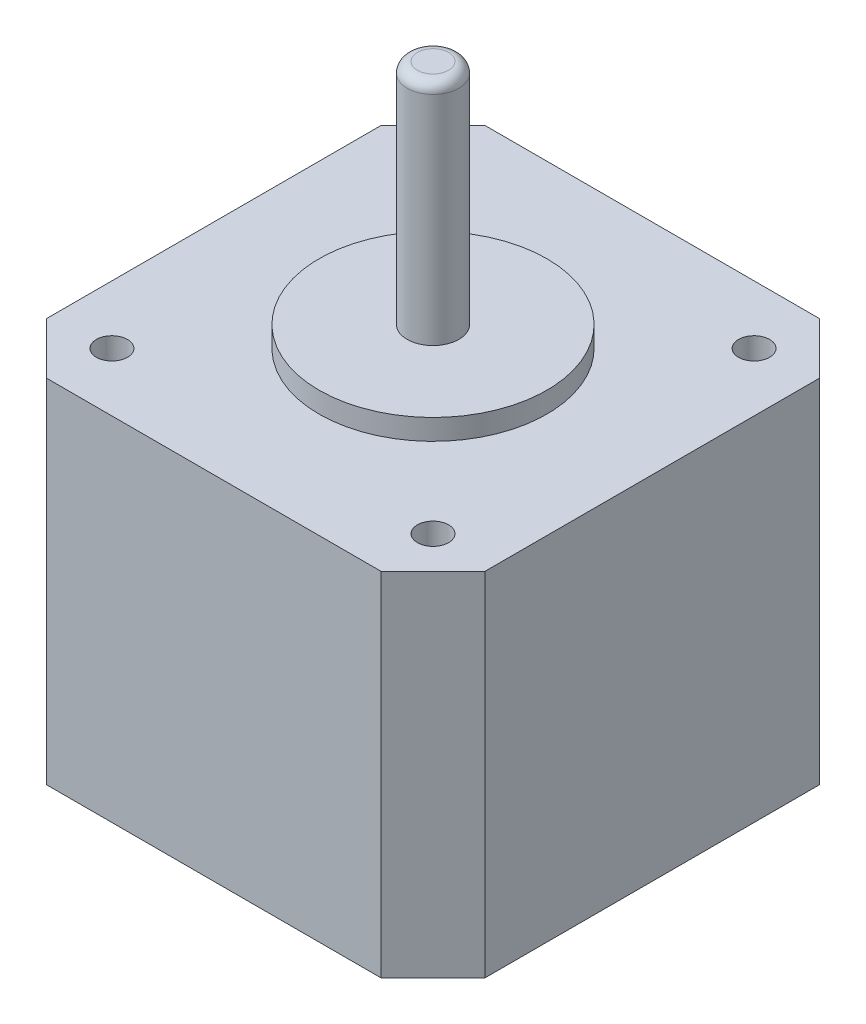
ISO-10303-21;
HEADER;
FILE_DESCRIPTION(('STEP AP214'),'2;1');
FILE_NAME('part.step','',(''),(''),'','','');
FILE_SCHEMA(('AUTOMOTIVE_DESIGN { 1 0 10303 214 1 1 1 1 }'));
ENDSEC;
DATA;
#1=APPLICATION_CONTEXT('core data for automotive mechanical design processes');
#2=APPLICATION_PROTOCOL_DEFINITION('international standard','automotive_design',2000,#1);
#3=PRODUCT_CONTEXT('',#1,'mechanical');
#4=PRODUCT('Part','Part','',(#3));
#5=PRODUCT_RELATED_PRODUCT_CATEGORY('part','',(#4));
#6=PRODUCT_DEFINITION_FORMATION('','',#4);
#7=PRODUCT_DEFINITION_CONTEXT('part definition',#1,'design');
#8=PRODUCT_DEFINITION('design','',#6,#7);
#9=PRODUCT_DEFINITION_SHAPE('','',#8);
#10=(LENGTH_UNIT() NAMED_UNIT(*) SI_UNIT(.MILLI.,.METRE.));
#11=(NAMED_UNIT(*) PLANE_ANGLE_UNIT() SI_UNIT($,.RADIAN.));
#12=(NAMED_UNIT(*) SI_UNIT($,.STERADIAN.) SOLID_ANGLE_UNIT());
#13=UNCERTAINTY_MEASURE_WITH_UNIT(LENGTH_MEASURE(1.E-05),#10,'distance_accuracy_value','');
#14=(GEOMETRIC_REPRESENTATION_CONTEXT(3) GLOBAL_UNCERTAINTY_ASSIGNED_CONTEXT((#13)) GLOBAL_UNIT_ASSIGNED_CONTEXT((#10,
#11,#12)) REPRESENTATION_CONTEXT('',''));
#15=CARTESIAN_POINT('',(0.,0.,0.));
#16=DIRECTION('',(0.,0.,1.));
#17=DIRECTION('',(1.,0.,0.));
#18=AXIS2_PLACEMENT_3D('',#15,#16,#17);
#19=CARTESIAN_POINT('',(21.15,34.,21.15));
#20=DIRECTION('',(-1.,0.,0.));
#21=DIRECTION('',(0.,0.,1.));
#22=AXIS2_PLACEMENT_3D('',#19,#20,#21);
#23=PLANE('',#22);
#24=DIRECTION('',(0.,0.,-1.));
#25=VECTOR('',#24,1.);
#26=CARTESIAN_POINT('',(21.15,0.,21.15));
#27=LINE('',#26,#25);
#28=CARTESIAN_POINT('',(21.15,0.,16.15));
#29=VERTEX_POINT('',#28);
#30=CARTESIAN_POINT('',(21.15,0.,-16.15));
#31=VERTEX_POINT('',#30);
#32=EDGE_CURVE('E138',#29,#31,#27,.T.);
#33=ORIENTED_EDGE('',*,*,#32,.T.);
#34=DIRECTION('',(0.,1.,0.));
#35=VECTOR('',#34,1.);
#36=CARTESIAN_POINT('',(21.15,34.,-16.15));
#37=LINE('',#36,#35);
#38=CARTESIAN_POINT('',(21.15,34.,-16.15));
#39=VERTEX_POINT('',#38);
#40=EDGE_CURVE('E113',#31,#39,#37,.T.);
#41=ORIENTED_EDGE('',*,*,#40,.T.);
#42=DIRECTION('',(0.,0.,-1.));
#43=VECTOR('',#42,1.);
#44=CARTESIAN_POINT('',(21.15,34.,21.15));
#45=LINE('',#44,#43);
#46=CARTESIAN_POINT('',(21.15,34.,16.15));
#47=VERTEX_POINT('',#46);
#48=EDGE_CURVE('E151',#47,#39,#45,.T.);
#49=ORIENTED_EDGE('',*,*,#48,.F.);
#50=DIRECTION('',(0.,-1.,0.));
#51=VECTOR('',#50,1.);
#52=CARTESIAN_POINT('',(21.15,34.,16.15));
#53=LINE('',#52,#51);
#54=EDGE_CURVE('E119',#47,#29,#53,.T.);
#55=ORIENTED_EDGE('',*,*,#54,.T.);
#56=EDGE_LOOP('',(#33,#41,#49,#55));
#57=FACE_BOUND('',#56,.T.);
#58=ADVANCED_FACE('F40',(#57),#23,.F.);
#59=CARTESIAN_POINT('',(-21.15,34.,-21.15));
#60=DIRECTION('',(0.,0.,1.));
#61=DIRECTION('',(1.,0.,0.));
#62=AXIS2_PLACEMENT_3D('',#59,#60,#61);
#63=PLANE('',#62);
#64=DIRECTION('',(-1.,0.,0.));
#65=VECTOR('',#64,1.);
#66=CARTESIAN_POINT('',(-21.15,34.,-21.15));
#67=LINE('',#66,#65);
#68=CARTESIAN_POINT('',(16.15,34.,-21.15));
#69=VERTEX_POINT('',#68);
#70=CARTESIAN_POINT('',(-16.15,34.,-21.15));
#71=VERTEX_POINT('',#70);
#72=EDGE_CURVE('E129',#69,#71,#67,.T.);
#73=ORIENTED_EDGE('',*,*,#72,.F.);
#74=DIRECTION('',(0.,-1.,0.));
#75=VECTOR('',#74,1.);
#76=CARTESIAN_POINT('',(16.15,34.,-21.15));
#77=LINE('',#76,#75);
#78=CARTESIAN_POINT('',(16.15,0.,-21.15));
#79=VERTEX_POINT('',#78);
#80=EDGE_CURVE('E112',#69,#79,#77,.T.);
#81=ORIENTED_EDGE('',*,*,#80,.T.);
#82=DIRECTION('',(-1.,0.,0.));
#83=VECTOR('',#82,1.);
#84=CARTESIAN_POINT('',(-21.15,0.,-21.15));
#85=LINE('',#84,#83);
#86=CARTESIAN_POINT('',(-16.15,0.,-21.15));
#87=VERTEX_POINT('',#86);
#88=EDGE_CURVE('E126',#79,#87,#85,.T.);
#89=ORIENTED_EDGE('',*,*,#88,.T.);
#90=DIRECTION('',(0.,1.,0.));
#91=VECTOR('',#90,1.);
#92=CARTESIAN_POINT('',(-16.15,34.,-21.15));
#93=LINE('',#92,#91);
#94=EDGE_CURVE('E132',#87,#71,#93,.T.);
#95=ORIENTED_EDGE('',*,*,#94,.T.);
#96=EDGE_LOOP('',(#73,#81,#89,#95));
#97=FACE_BOUND('',#96,.T.);
#98=ADVANCED_FACE('F125',(#97),#63,.F.);
#99=CARTESIAN_POINT('',(-21.15,34.,21.15));
#100=DIRECTION('',(1.,0.,0.));
#101=DIRECTION('',(0.,0.,-1.));
#102=AXIS2_PLACEMENT_3D('',#99,#100,#101);
#103=PLANE('',#102);
#104=DIRECTION('',(0.,0.,1.));
#105=VECTOR('',#104,1.);
#106=CARTESIAN_POINT('',(-21.15,34.,21.15));
#107=LINE('',#106,#105);
#108=CARTESIAN_POINT('',(-21.15,34.,-16.15));
#109=VERTEX_POINT('',#108);
#110=CARTESIAN_POINT('',(-21.15,34.,16.15));
#111=VERTEX_POINT('',#110);
#112=EDGE_CURVE('E257',#109,#111,#107,.T.);
#113=ORIENTED_EDGE('',*,*,#112,.F.);
#114=DIRECTION('',(0.,-1.,0.));
#115=VECTOR('',#114,1.);
#116=CARTESIAN_POINT('',(-21.15,34.,-16.15));
#117=LINE('',#116,#115);
#118=CARTESIAN_POINT('',(-21.15,0.,-16.15));
#119=VERTEX_POINT('',#118);
#120=EDGE_CURVE('E189',#109,#119,#117,.T.);
#121=ORIENTED_EDGE('',*,*,#120,.T.);
#122=DIRECTION('',(0.,0.,1.));
#123=VECTOR('',#122,1.);
#124=CARTESIAN_POINT('',(-21.15,0.,21.15));
#125=LINE('',#124,#123);
#126=CARTESIAN_POINT('',(-21.15,0.,16.15));
#127=VERTEX_POINT('',#126);
#128=EDGE_CURVE('E137',#119,#127,#125,.T.);
#129=ORIENTED_EDGE('',*,*,#128,.T.);
#130=DIRECTION('',(0.,1.,0.));
#131=VECTOR('',#130,1.);
#132=CARTESIAN_POINT('',(-21.15,34.,16.15));
#133=LINE('',#132,#131);
#134=EDGE_CURVE('E186',#127,#111,#133,.T.);
#135=ORIENTED_EDGE('',*,*,#134,.T.);
#136=EDGE_LOOP('',(#113,#121,#129,#135));
#137=FACE_BOUND('',#136,.T.);
#138=ADVANCED_FACE('F219',(#137),#103,.F.);
#139=CARTESIAN_POINT('',(-21.15,34.,21.15));
#140=DIRECTION('',(0.,0.,-1.));
#141=DIRECTION('',(-1.,0.,0.));
#142=AXIS2_PLACEMENT_3D('',#139,#140,#141);
#143=PLANE('',#142);
#144=DIRECTION('',(1.,0.,0.));
#145=VECTOR('',#144,1.);
#146=CARTESIAN_POINT('',(-21.15,34.,21.15));
#147=LINE('',#146,#145);
#148=CARTESIAN_POINT('',(-16.15,34.,21.15));
#149=VERTEX_POINT('',#148);
#150=CARTESIAN_POINT('',(16.15,34.,21.15));
#151=VERTEX_POINT('',#150);
#152=EDGE_CURVE('E160',#149,#151,#147,.T.);
#153=ORIENTED_EDGE('',*,*,#152,.F.);
#154=DIRECTION('',(0.,-1.,0.));
#155=VECTOR('',#154,1.);
#156=CARTESIAN_POINT('',(-16.15,34.,21.15));
#157=LINE('',#156,#155);
#158=CARTESIAN_POINT('',(-16.15,0.,21.15));
#159=VERTEX_POINT('',#158);
#160=EDGE_CURVE('E195',#149,#159,#157,.T.);
#161=ORIENTED_EDGE('',*,*,#160,.T.);
#162=DIRECTION('',(1.,0.,0.));
#163=VECTOR('',#162,1.);
#164=CARTESIAN_POINT('',(-21.15,0.,21.15));
#165=LINE('',#164,#163);
#166=CARTESIAN_POINT('',(16.15,0.,21.15));
#167=VERTEX_POINT('',#166);
#168=EDGE_CURVE('E143',#159,#167,#165,.T.);
#169=ORIENTED_EDGE('',*,*,#168,.T.);
#170=DIRECTION('',(0.,1.,0.));
#171=VECTOR('',#170,1.);
#172=CARTESIAN_POINT('',(16.15,34.,21.15));
#173=LINE('',#172,#171);
#174=EDGE_CURVE('E56',#167,#151,#173,.T.);
#175=ORIENTED_EDGE('',*,*,#174,.T.);
#176=EDGE_LOOP('',(#153,#161,#169,#175));
#177=FACE_BOUND('',#176,.T.);
#178=ADVANCED_FACE('F249',(#177),#143,.F.);
#179=CARTESIAN_POINT('',(0.,34.,0.));
#180=DIRECTION('',(0.,-1.,0.));
#181=DIRECTION('',(0.,0.,-1.));
#182=AXIS2_PLACEMENT_3D('',#179,#180,#181);
#183=PLANE('',#182);
#184=CARTESIAN_POINT('',(-15.5,34.,15.5));
#185=DIRECTION('',(0.,1.,0.));
#186=DIRECTION('',(0.,0.,1.));
#187=AXIS2_PLACEMENT_3D('',#184,#185,#186);
#188=CIRCLE('',#187,1.5);
#189=CARTESIAN_POINT('',(-15.5,34.,17.));
#190=VERTEX_POINT('',#189);
#191=EDGE_CURVE('E473',#190,#190,#188,.T.);
#192=ORIENTED_EDGE('',*,*,#191,.F.);
#193=EDGE_LOOP('',(#192));
#194=FACE_BOUND('',#193,.T.);
#195=CARTESIAN_POINT('',(15.5,34.,15.5));
#196=DIRECTION('',(0.,1.,0.));
#197=DIRECTION('',(0.,0.,1.));
#198=AXIS2_PLACEMENT_3D('',#195,#196,#197);
#199=CIRCLE('',#198,1.5);
#200=CARTESIAN_POINT('',(15.5,34.,17.));
#201=VERTEX_POINT('',#200);
#202=EDGE_CURVE('E481',#201,#201,#199,.T.);
#203=ORIENTED_EDGE('',*,*,#202,.F.);
#204=EDGE_LOOP('',(#203));
#205=FACE_BOUND('',#204,.T.);
#206=CARTESIAN_POINT('',(15.5,34.,-15.5));
#207=DIRECTION('',(0.,1.,0.));
#208=DIRECTION('',(0.,0.,1.));
#209=AXIS2_PLACEMENT_3D('',#206,#207,#208);
#210=CIRCLE('',#209,1.5);
#211=CARTESIAN_POINT('',(15.5,34.,-14.));
#212=VERTEX_POINT('',#211);
#213=EDGE_CURVE('E489',#212,#212,#210,.T.);
#214=ORIENTED_EDGE('',*,*,#213,.F.);
#215=EDGE_LOOP('',(#214));
#216=FACE_BOUND('',#215,.T.);
#217=CARTESIAN_POINT('',(-15.5,34.,-15.5));
#218=DIRECTION('',(0.,1.,0.));
#219=DIRECTION('',(0.,0.,1.));
#220=AXIS2_PLACEMENT_3D('',#217,#218,#219);
#221=CIRCLE('',#220,1.5);
#222=CARTESIAN_POINT('',(-15.5,34.,-14.));
#223=VERTEX_POINT('',#222);
#224=EDGE_CURVE('E466',#223,#223,#221,.T.);
#225=ORIENTED_EDGE('',*,*,#224,.F.);
#226=EDGE_LOOP('',(#225));
#227=FACE_BOUND('',#226,.T.);
#228=CARTESIAN_POINT('',(0.,34.,0.));
#229=DIRECTION('',(0.,-1.,0.));
#230=DIRECTION('',(0.,0.,-1.));
#231=AXIS2_PLACEMENT_3D('',#228,#229,#230);
#232=CIRCLE('',#231,11.);
#233=CARTESIAN_POINT('',(0.,34.,-11.));
#234=VERTEX_POINT('',#233);
#235=EDGE_CURVE('E156',#234,#234,#232,.F.);
#236=ORIENTED_EDGE('',*,*,#235,.F.);
#237=EDGE_LOOP('',(#236));
#238=FACE_BOUND('',#237,.T.);
#239=ORIENTED_EDGE('',*,*,#48,.T.);
#240=DIRECTION('',(0.707106781186546,0.,0.707106781186549));
#241=VECTOR('',#240,1.);
#242=CARTESIAN_POINT('',(16.15,34.,-21.15));
#243=LINE('',#242,#241);
#244=EDGE_CURVE('E183',#39,#69,#243,.F.);
#245=ORIENTED_EDGE('',*,*,#244,.T.);
#246=ORIENTED_EDGE('',*,*,#72,.T.);
#247=DIRECTION('',(0.707106781186549,0.,-0.707106781186546));
#248=VECTOR('',#247,1.);
#249=CARTESIAN_POINT('',(-21.15,34.,-16.15));
#250=LINE('',#249,#248);
#251=EDGE_CURVE('E180',#71,#109,#250,.F.);
#252=ORIENTED_EDGE('',*,*,#251,.T.);
#253=ORIENTED_EDGE('',*,*,#112,.T.);
#254=DIRECTION('',(-0.707106781186547,0.,-0.707106781186549));
#255=VECTOR('',#254,1.);
#256=CARTESIAN_POINT('',(-16.15,34.,21.15));
#257=LINE('',#256,#255);
#258=EDGE_CURVE('E63',#111,#149,#257,.F.);
#259=ORIENTED_EDGE('',*,*,#258,.T.);
#260=ORIENTED_EDGE('',*,*,#152,.T.);
#261=DIRECTION('',(-0.707106781186549,0.,0.707106781186547));
#262=VECTOR('',#261,1.);
#263=CARTESIAN_POINT('',(21.15,34.,16.15));
#264=LINE('',#263,#262);
#265=EDGE_CURVE('E175',#151,#47,#264,.F.);
#266=ORIENTED_EDGE('',*,*,#265,.T.);
#267=EDGE_LOOP('',(#239,#245,#246,#252,#253,#259,#260,#266));
#268=FACE_BOUND('',#267,.T.);
#269=ADVANCED_FACE('F264',(#194,#205,#216,#227,#238,#268),#183,.F.);
#270=CARTESIAN_POINT('',(0.,0.,0.));
#271=DIRECTION('',(0.,-1.,0.));
#272=DIRECTION('',(0.,0.,-1.));
#273=AXIS2_PLACEMENT_3D('',#270,#271,#272);
#274=PLANE('',#273);
#275=ORIENTED_EDGE('',*,*,#88,.F.);
#276=DIRECTION('',(-0.707106781186546,0.,-0.707106781186549));
#277=VECTOR('',#276,1.);
#278=CARTESIAN_POINT('',(18.65,0.,-18.65));
#279=LINE('',#278,#277);
#280=EDGE_CURVE('E108',#79,#31,#279,.F.);
#281=ORIENTED_EDGE('',*,*,#280,.T.);
#282=ORIENTED_EDGE('',*,*,#32,.F.);
#283=DIRECTION('',(0.707106781186549,0.,-0.707106781186547));
#284=VECTOR('',#283,1.);
#285=CARTESIAN_POINT('',(18.65,0.,18.65));
#286=LINE('',#285,#284);
#287=EDGE_CURVE('E131',#29,#167,#286,.F.);
#288=ORIENTED_EDGE('',*,*,#287,.T.);
#289=ORIENTED_EDGE('',*,*,#168,.F.);
#290=DIRECTION('',(0.707106781186547,0.,0.707106781186549));
#291=VECTOR('',#290,1.);
#292=CARTESIAN_POINT('',(-18.65,0.,18.65));
#293=LINE('',#292,#291);
#294=EDGE_CURVE('E165',#159,#127,#293,.F.);
#295=ORIENTED_EDGE('',*,*,#294,.T.);
#296=ORIENTED_EDGE('',*,*,#128,.F.);
#297=DIRECTION('',(-0.707106781186549,0.,0.707106781186546));
#298=VECTOR('',#297,1.);
#299=CARTESIAN_POINT('',(-18.65,0.,-18.65));
#300=LINE('',#299,#298);
#301=EDGE_CURVE('E120',#119,#87,#300,.F.);
#302=ORIENTED_EDGE('',*,*,#301,.T.);
#303=EDGE_LOOP('',(#275,#281,#282,#288,#289,#295,#296,#302));
#304=FACE_BOUND('',#303,.T.);
#305=ADVANCED_FACE('F134',(#304),#274,.T.);
#306=CARTESIAN_POINT('',(0.,36.,0.));
#307=DIRECTION('',(0.,-1.,0.));
#308=DIRECTION('',(0.,0.,-1.));
#309=AXIS2_PLACEMENT_3D('',#306,#307,#308);
#310=CYLINDRICAL_SURFACE('',#309,11.);
#311=CARTESIAN_POINT('',(0.,36.,0.));
#312=DIRECTION('',(0.,1.,0.));
#313=DIRECTION('',(0.,0.,1.));
#314=AXIS2_PLACEMENT_3D('',#311,#312,#313);
#315=CIRCLE('',#314,11.);
#316=CARTESIAN_POINT('',(0.,36.,11.));
#317=VERTEX_POINT('',#316);
#318=EDGE_CURVE('E155',#317,#317,#315,.T.);
#319=ORIENTED_EDGE('',*,*,#318,.F.);
#320=EDGE_LOOP('',(#319));
#321=FACE_BOUND('',#320,.T.);
#322=ORIENTED_EDGE('',*,*,#235,.T.);
#323=EDGE_LOOP('',(#322));
#324=FACE_BOUND('',#323,.T.);
#325=ADVANCED_FACE('F272',(#321,#324),#310,.T.);
#326=CARTESIAN_POINT('',(0.,36.,0.));
#327=DIRECTION('',(0.,1.,0.));
#328=DIRECTION('',(0.,0.,1.));
#329=AXIS2_PLACEMENT_3D('',#326,#327,#328);
#330=PLANE('',#329);
#331=CARTESIAN_POINT('',(0.,36.,0.));
#332=DIRECTION('',(0.,1.,0.));
#333=DIRECTION('',(0.,0.,1.));
#334=AXIS2_PLACEMENT_3D('',#331,#332,#333);
#335=CIRCLE('',#334,2.5);
#336=CARTESIAN_POINT('',(0.,36.,2.5));
#337=VERTEX_POINT('',#336);
#338=EDGE_CURVE('E145',#337,#337,#335,.T.);
#339=ORIENTED_EDGE('',*,*,#338,.F.);
#340=EDGE_LOOP('',(#339));
#341=FACE_BOUND('',#340,.T.);
#342=ORIENTED_EDGE('',*,*,#318,.T.);
#343=EDGE_LOOP('',(#342));
#344=FACE_BOUND('',#343,.T.);
#345=ADVANCED_FACE('F339',(#341,#344),#330,.T.);
#346=CARTESIAN_POINT('',(0.,58.,0.));
#347=DIRECTION('',(0.,1.,0.));
#348=DIRECTION('',(0.,0.,1.));
#349=AXIS2_PLACEMENT_3D('',#346,#347,#348);
#350=PLANE('',#349);
#351=CARTESIAN_POINT('',(0.,58.,0.));
#352=DIRECTION('',(0.,1.,0.));
#353=DIRECTION('',(0.,0.,1.));
#354=AXIS2_PLACEMENT_3D('',#351,#352,#353);
#355=CIRCLE('',#354,1.5);
#356=CARTESIAN_POINT('',(0.,58.,1.5));
#357=VERTEX_POINT('',#356);
#358=EDGE_CURVE('E49',#357,#357,#355,.T.);
#359=ORIENTED_EDGE('',*,*,#358,.T.);
#360=EDGE_LOOP('',(#359));
#361=FACE_BOUND('',#360,.T.);
#362=ADVANCED_FACE('F202',(#361),#350,.T.);
#363=CARTESIAN_POINT('',(0.,58.,0.));
#364=DIRECTION('',(0.,-1.,0.));
#365=DIRECTION('',(0.,0.,-1.));
#366=AXIS2_PLACEMENT_3D('',#363,#364,#365);
#367=CYLINDRICAL_SURFACE('',#366,2.5);
#368=CARTESIAN_POINT('',(0.,57.,0.));
#369=DIRECTION('',(0.,1.,0.));
#370=DIRECTION('',(0.,0.,1.));
#371=AXIS2_PLACEMENT_3D('',#368,#369,#370);
#372=CIRCLE('',#371,2.5);
#373=CARTESIAN_POINT('',(0.,57.,2.5));
#374=VERTEX_POINT('',#373);
#375=EDGE_CURVE('E11',#374,#374,#372,.F.);
#376=ORIENTED_EDGE('',*,*,#375,.T.);
#377=EDGE_LOOP('',(#376));
#378=FACE_BOUND('',#377,.T.);
#379=ORIENTED_EDGE('',*,*,#338,.T.);
#380=EDGE_LOOP('',(#379));
#381=FACE_BOUND('',#380,.T.);
#382=ADVANCED_FACE('F278',(#378,#381),#367,.T.);
#383=CARTESIAN_POINT('',(-15.5,29.5,-15.5));
#384=DIRECTION('',(0.,1.,0.));
#385=DIRECTION('',(0.,0.,1.));
#386=AXIS2_PLACEMENT_3D('',#383,#384,#385);
#387=CYLINDRICAL_SURFACE('',#386,1.5);
#388=CARTESIAN_POINT('',(-15.5,29.5,-15.5));
#389=DIRECTION('',(0.,1.,0.));
#390=DIRECTION('',(0.,0.,1.));
#391=AXIS2_PLACEMENT_3D('',#388,#389,#390);
#392=CIRCLE('',#391,1.5);
#393=CARTESIAN_POINT('',(-15.5,29.5,-14.));
#394=VERTEX_POINT('',#393);
#395=EDGE_CURVE('E463',#394,#394,#392,.T.);
#396=ORIENTED_EDGE('',*,*,#395,.F.);
#397=EDGE_LOOP('',(#396));
#398=FACE_BOUND('',#397,.T.);
#399=ORIENTED_EDGE('',*,*,#224,.T.);
#400=EDGE_LOOP('',(#399));
#401=FACE_BOUND('',#400,.T.);
#402=ADVANCED_FACE('F347',(#398,#401),#387,.F.);
#403=CARTESIAN_POINT('',(-15.5,29.5,-15.5));
#404=DIRECTION('',(0.,1.,0.));
#405=DIRECTION('',(0.,0.,1.));
#406=AXIS2_PLACEMENT_3D('',#403,#404,#405);
#407=PLANE('',#406);
#408=ORIENTED_EDGE('',*,*,#395,.T.);
#409=EDGE_LOOP('',(#408));
#410=FACE_BOUND('',#409,.T.);
#411=ADVANCED_FACE('F359',(#410),#407,.T.);
#412=CARTESIAN_POINT('',(15.5,29.5,-15.5));
#413=DIRECTION('',(0.,1.,0.));
#414=DIRECTION('',(0.,0.,1.));
#415=AXIS2_PLACEMENT_3D('',#412,#413,#414);
#416=CYLINDRICAL_SURFACE('',#415,1.5);
#417=CARTESIAN_POINT('',(15.5,29.5,-15.5));
#418=DIRECTION('',(0.,1.,0.));
#419=DIRECTION('',(0.,0.,1.));
#420=AXIS2_PLACEMENT_3D('',#417,#418,#419);
#421=CIRCLE('',#420,1.5);
#422=CARTESIAN_POINT('',(15.5,29.5,-14.));
#423=VERTEX_POINT('',#422);
#424=EDGE_CURVE('E471',#423,#423,#421,.T.);
#425=ORIENTED_EDGE('',*,*,#424,.F.);
#426=EDGE_LOOP('',(#425));
#427=FACE_BOUND('',#426,.T.);
#428=ORIENTED_EDGE('',*,*,#213,.T.);
#429=EDGE_LOOP('',(#428));
#430=FACE_BOUND('',#429,.T.);
#431=ADVANCED_FACE('F368',(#427,#430),#416,.F.);
#432=CARTESIAN_POINT('',(15.5,29.5,-15.5));
#433=DIRECTION('',(0.,1.,0.));
#434=DIRECTION('',(0.,0.,1.));
#435=AXIS2_PLACEMENT_3D('',#432,#433,#434);
#436=PLANE('',#435);
#437=ORIENTED_EDGE('',*,*,#424,.T.);
#438=EDGE_LOOP('',(#437));
#439=FACE_BOUND('',#438,.T.);
#440=ADVANCED_FACE('F376',(#439),#436,.T.);
#441=CARTESIAN_POINT('',(15.5,29.5,15.5));
#442=DIRECTION('',(0.,1.,0.));
#443=DIRECTION('',(0.,0.,1.));
#444=AXIS2_PLACEMENT_3D('',#441,#442,#443);
#445=CYLINDRICAL_SURFACE('',#444,1.5);
#446=CARTESIAN_POINT('',(15.5,29.5,15.5));
#447=DIRECTION('',(0.,1.,0.));
#448=DIRECTION('',(0.,0.,1.));
#449=AXIS2_PLACEMENT_3D('',#446,#447,#448);
#450=CIRCLE('',#449,1.5);
#451=CARTESIAN_POINT('',(15.5,29.5,17.));
#452=VERTEX_POINT('',#451);
#453=EDGE_CURVE('E485',#452,#452,#450,.T.);
#454=ORIENTED_EDGE('',*,*,#453,.F.);
#455=EDGE_LOOP('',(#454));
#456=FACE_BOUND('',#455,.T.);
#457=ORIENTED_EDGE('',*,*,#202,.T.);
#458=EDGE_LOOP('',(#457));
#459=FACE_BOUND('',#458,.T.);
#460=ADVANCED_FACE('F384',(#456,#459),#445,.F.);
#461=CARTESIAN_POINT('',(15.5,29.5,15.5));
#462=DIRECTION('',(0.,1.,0.));
#463=DIRECTION('',(0.,0.,1.));
#464=AXIS2_PLACEMENT_3D('',#461,#462,#463);
#465=PLANE('',#464);
#466=ORIENTED_EDGE('',*,*,#453,.T.);
#467=EDGE_LOOP('',(#466));
#468=FACE_BOUND('',#467,.T.);
#469=ADVANCED_FACE('F392',(#468),#465,.T.);
#470=CARTESIAN_POINT('',(-15.5,29.5,15.5));
#471=DIRECTION('',(0.,1.,0.));
#472=DIRECTION('',(0.,0.,1.));
#473=AXIS2_PLACEMENT_3D('',#470,#471,#472);
#474=CYLINDRICAL_SURFACE('',#473,1.5);
#475=CARTESIAN_POINT('',(-15.5,29.5,15.5));
#476=DIRECTION('',(0.,1.,0.));
#477=DIRECTION('',(0.,0.,1.));
#478=AXIS2_PLACEMENT_3D('',#475,#476,#477);
#479=CIRCLE('',#478,1.5);
#480=CARTESIAN_POINT('',(-15.5,29.5,17.));
#481=VERTEX_POINT('',#480);
#482=EDGE_CURVE('E477',#481,#481,#479,.T.);
#483=ORIENTED_EDGE('',*,*,#482,.F.);
#484=EDGE_LOOP('',(#483));
#485=FACE_BOUND('',#484,.T.);
#486=ORIENTED_EDGE('',*,*,#191,.T.);
#487=EDGE_LOOP('',(#486));
#488=FACE_BOUND('',#487,.T.);
#489=ADVANCED_FACE('F400',(#485,#488),#474,.F.);
#490=CARTESIAN_POINT('',(-15.5,29.5,15.5));
#491=DIRECTION('',(0.,1.,0.));
#492=DIRECTION('',(0.,0.,1.));
#493=AXIS2_PLACEMENT_3D('',#490,#491,#492);
#494=PLANE('',#493);
#495=ORIENTED_EDGE('',*,*,#482,.T.);
#496=EDGE_LOOP('',(#495));
#497=FACE_BOUND('',#496,.T.);
#498=ADVANCED_FACE('F230',(#497),#494,.T.);
#499=CARTESIAN_POINT('',(16.15,34.,-21.15));
#500=DIRECTION('',(-0.707106781186549,0.,0.707106781186546));
#501=DIRECTION('',(0.,-1.,0.));
#502=AXIS2_PLACEMENT_3D('',#499,#500,#501);
#503=PLANE('',#502);
#504=ORIENTED_EDGE('',*,*,#244,.F.);
#505=ORIENTED_EDGE('',*,*,#40,.F.);
#506=ORIENTED_EDGE('',*,*,#280,.F.);
#507=ORIENTED_EDGE('',*,*,#80,.F.);
#508=EDGE_LOOP('',(#504,#505,#506,#507));
#509=FACE_BOUND('',#508,.T.);
#510=ADVANCED_FACE('F111',(#509),#503,.F.);
#511=CARTESIAN_POINT('',(-21.15,34.,-16.15));
#512=DIRECTION('',(0.707106781186546,0.,0.707106781186549));
#513=DIRECTION('',(0.,-1.,0.));
#514=AXIS2_PLACEMENT_3D('',#511,#512,#513);
#515=PLANE('',#514);
#516=ORIENTED_EDGE('',*,*,#251,.F.);
#517=ORIENTED_EDGE('',*,*,#94,.F.);
#518=ORIENTED_EDGE('',*,*,#301,.F.);
#519=ORIENTED_EDGE('',*,*,#120,.F.);
#520=EDGE_LOOP('',(#516,#517,#518,#519));
#521=FACE_BOUND('',#520,.T.);
#522=ADVANCED_FACE('F229',(#521),#515,.F.);
#523=CARTESIAN_POINT('',(-16.15,34.,21.15));
#524=DIRECTION('',(0.707106781186549,0.,-0.707106781186547));
#525=DIRECTION('',(0.,-1.,0.));
#526=AXIS2_PLACEMENT_3D('',#523,#524,#525);
#527=PLANE('',#526);
#528=ORIENTED_EDGE('',*,*,#258,.F.);
#529=ORIENTED_EDGE('',*,*,#134,.F.);
#530=ORIENTED_EDGE('',*,*,#294,.F.);
#531=ORIENTED_EDGE('',*,*,#160,.F.);
#532=EDGE_LOOP('',(#528,#529,#530,#531));
#533=FACE_BOUND('',#532,.T.);
#534=ADVANCED_FACE('F210',(#533),#527,.F.);
#535=CARTESIAN_POINT('',(21.15,34.,16.15));
#536=DIRECTION('',(-0.707106781186546,0.,-0.707106781186548));
#537=DIRECTION('',(0.,-1.,0.));
#538=AXIS2_PLACEMENT_3D('',#535,#536,#537);
#539=PLANE('',#538);
#540=ORIENTED_EDGE('',*,*,#265,.F.);
#541=ORIENTED_EDGE('',*,*,#174,.F.);
#542=ORIENTED_EDGE('',*,*,#287,.F.);
#543=ORIENTED_EDGE('',*,*,#54,.F.);
#544=EDGE_LOOP('',(#540,#541,#542,#543));
#545=FACE_BOUND('',#544,.T.);
#546=ADVANCED_FACE('F205',(#545),#539,.F.);
#547=CARTESIAN_POINT('',(0.,57.,0.));
#548=DIRECTION('',(0.,1.,0.));
#549=DIRECTION('',(0.,0.,1.));
#550=AXIS2_PLACEMENT_3D('',#547,#548,#549);
#551=TOROIDAL_SURFACE('',#550,1.5,1.);
#552=ORIENTED_EDGE('',*,*,#375,.F.);
#553=EDGE_LOOP('',(#552));
#554=FACE_BOUND('',#553,.T.);
#555=ORIENTED_EDGE('',*,*,#358,.F.);
#556=EDGE_LOOP('',(#555));
#557=FACE_BOUND('',#556,.T.);
#558=ADVANCED_FACE('F42',(#554,#557),#551,.T.);
#559=CLOSED_SHELL('',(#58,#98,#138,#178,#269,#305,#325,#345,#362,#382,#402,#411,#431,#440,#460,
#469,#489,#498,#510,#522,#534,#546,#558));
#560=MANIFOLD_SOLID_BREP('B2',#559);
#561=ADVANCED_BREP_SHAPE_REPRESENTATION('',(#18,#560),#14);
#562=SHAPE_DEFINITION_REPRESENTATION(#9,#561);
ENDSEC;
END-ISO-10303-21;
